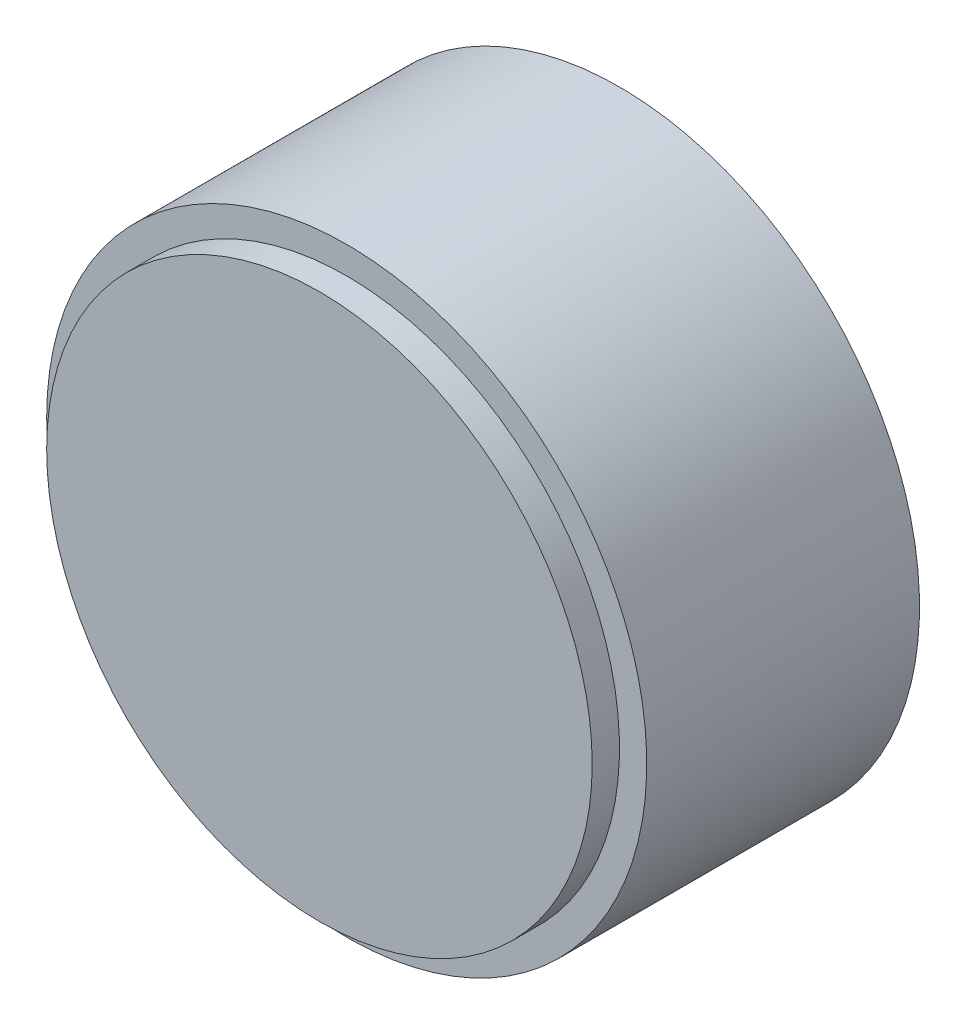
ISO-10303-21;
HEADER;
FILE_DESCRIPTION(('STEP AP214'),'2;1');
FILE_NAME('part.step','',(''),(''),'','','');
FILE_SCHEMA(('AUTOMOTIVE_DESIGN { 1 0 10303 214 1 1 1 1 }'));
ENDSEC;
DATA;
#1=APPLICATION_CONTEXT('core data for automotive mechanical design processes');
#2=APPLICATION_PROTOCOL_DEFINITION('international standard','automotive_design',2000,#1);
#3=PRODUCT_CONTEXT('',#1,'mechanical');
#4=PRODUCT('Part','Part','',(#3));
#5=PRODUCT_RELATED_PRODUCT_CATEGORY('part','',(#4));
#6=PRODUCT_DEFINITION_FORMATION('','',#4);
#7=PRODUCT_DEFINITION_CONTEXT('part definition',#1,'design');
#8=PRODUCT_DEFINITION('design','',#6,#7);
#9=PRODUCT_DEFINITION_SHAPE('','',#8);
#10=(LENGTH_UNIT() NAMED_UNIT(*) SI_UNIT(.MILLI.,.METRE.));
#11=(NAMED_UNIT(*) PLANE_ANGLE_UNIT() SI_UNIT($,.RADIAN.));
#12=(NAMED_UNIT(*) SI_UNIT($,.STERADIAN.) SOLID_ANGLE_UNIT());
#13=UNCERTAINTY_MEASURE_WITH_UNIT(LENGTH_MEASURE(1.E-05),#10,'distance_accuracy_value','');
#14=(GEOMETRIC_REPRESENTATION_CONTEXT(3) GLOBAL_UNCERTAINTY_ASSIGNED_CONTEXT((#13)) GLOBAL_UNIT_ASSIGNED_CONTEXT((#10,
#11,#12)) REPRESENTATION_CONTEXT('',''));
#15=CARTESIAN_POINT('',(0.,0.,0.));
#16=DIRECTION('',(0.,0.,1.));
#17=DIRECTION('',(1.,0.,0.));
#18=AXIS2_PLACEMENT_3D('',#15,#16,#17);
#19=CARTESIAN_POINT('',(0.,0.,35.));
#20=DIRECTION('',(0.,0.,-1.));
#21=DIRECTION('',(-1.,0.,0.));
#22=AXIS2_PLACEMENT_3D('',#19,#20,#21);
#23=CYLINDRICAL_SURFACE('',#22,30.);
#24=CARTESIAN_POINT('',(0.,0.,2.));
#25=DIRECTION('',(0.,0.,-1.));
#26=DIRECTION('',(-1.,0.,0.));
#27=AXIS2_PLACEMENT_3D('',#24,#25,#26);
#28=CIRCLE('',#27,30.);
#29=CARTESIAN_POINT('',(-30.,0.,2.));
#30=VERTEX_POINT('',#29);
#31=EDGE_CURVE('E101',#30,#30,#28,.T.);
#32=ORIENTED_EDGE('',*,*,#31,.T.);
#33=EDGE_LOOP('',(#32));
#34=FACE_BOUND('',#33,.T.);
#35=CARTESIAN_POINT('',(0.,0.,0.));
#36=DIRECTION('',(0.,0.,1.));
#37=DIRECTION('',(1.,0.,0.));
#38=AXIS2_PLACEMENT_3D('',#35,#36,#37);
#39=CIRCLE('',#38,30.);
#40=CARTESIAN_POINT('',(30.,0.,0.));
#41=VERTEX_POINT('',#40);
#42=EDGE_CURVE('E49',#41,#41,#39,.T.);
#43=ORIENTED_EDGE('',*,*,#42,.T.);
#44=EDGE_LOOP('',(#43));
#45=FACE_BOUND('',#44,.T.);
#46=ADVANCED_FACE('F37',(#34,#45),#23,.T.);
#47=CARTESIAN_POINT('',(0.,0.,0.));
#48=DIRECTION('',(0.,0.,1.));
#49=DIRECTION('',(1.,0.,0.));
#50=AXIS2_PLACEMENT_3D('',#47,#48,#49);
#51=PLANE('',#50);
#52=CARTESIAN_POINT('',(0.,8.,0.));
#53=DIRECTION('',(0.,0.,-1.));
#54=DIRECTION('',(-1.,0.,0.));
#55=AXIS2_PLACEMENT_3D('',#52,#53,#54);
#56=CIRCLE('',#55,2.);
#57=CARTESIAN_POINT('',(-2.,8.,0.));
#58=VERTEX_POINT('',#57);
#59=EDGE_CURVE('E74',#58,#58,#56,.T.);
#60=ORIENTED_EDGE('',*,*,#59,.F.);
#61=EDGE_LOOP('',(#60));
#62=FACE_BOUND('',#61,.T.);
#63=CARTESIAN_POINT('',(7.99999999999977,-2.27373675443232E-13,0.));
#64=DIRECTION('',(0.,0.,-1.));
#65=DIRECTION('',(-1.,0.,0.));
#66=AXIS2_PLACEMENT_3D('',#63,#64,#65);
#67=CIRCLE('',#66,2.00000000000036);
#68=CARTESIAN_POINT('',(5.99999999999941,-2.27373675443232E-13,0.));
#69=VERTEX_POINT('',#68);
#70=EDGE_CURVE('E75',#69,#69,#67,.T.);
#71=ORIENTED_EDGE('',*,*,#70,.F.);
#72=EDGE_LOOP('',(#71));
#73=FACE_BOUND('',#72,.T.);
#74=CARTESIAN_POINT('',(-4.52787916007828E-13,-8.,0.));
#75=DIRECTION('',(0.,0.,-1.));
#76=DIRECTION('',(-1.,0.,0.));
#77=AXIS2_PLACEMENT_3D('',#74,#75,#76);
#78=CIRCLE('',#77,2.00000000000049);
#79=CARTESIAN_POINT('',(-2.00000000000094,-8.,0.));
#80=VERTEX_POINT('',#79);
#81=EDGE_CURVE('E84',#80,#80,#78,.T.);
#82=ORIENTED_EDGE('',*,*,#81,.F.);
#83=EDGE_LOOP('',(#82));
#84=FACE_BOUND('',#83,.T.);
#85=CARTESIAN_POINT('',(-8.00000000000023,2.26393958003914E-13,0.));
#86=DIRECTION('',(0.,0.,-1.));
#87=DIRECTION('',(-1.,0.,0.));
#88=AXIS2_PLACEMENT_3D('',#85,#86,#87);
#89=CIRCLE('',#88,2.00000000000018);
#90=CARTESIAN_POINT('',(-10.0000000000004,2.26393958003914E-13,0.));
#91=VERTEX_POINT('',#90);
#92=EDGE_CURVE('E57',#91,#91,#89,.T.);
#93=ORIENTED_EDGE('',*,*,#92,.F.);
#94=EDGE_LOOP('',(#93));
#95=FACE_BOUND('',#94,.T.);
#96=CARTESIAN_POINT('',(0.,0.,0.));
#97=DIRECTION('',(0.,0.,-1.));
#98=DIRECTION('',(-1.,0.,0.));
#99=AXIS2_PLACEMENT_3D('',#96,#97,#98);
#100=CIRCLE('',#99,2.);
#101=CARTESIAN_POINT('',(-2.,0.,0.));
#102=VERTEX_POINT('',#101);
#103=EDGE_CURVE('E66',#102,#102,#100,.T.);
#104=ORIENTED_EDGE('',*,*,#103,.F.);
#105=EDGE_LOOP('',(#104));
#106=FACE_BOUND('',#105,.T.);
#107=ORIENTED_EDGE('',*,*,#42,.F.);
#108=EDGE_LOOP('',(#107));
#109=FACE_BOUND('',#108,.T.);
#110=ADVANCED_FACE('F133',(#62,#73,#84,#95,#106,#109),#51,.F.);
#111=CARTESIAN_POINT('',(0.,0.,10.));
#112=DIRECTION('',(0.,0.,-1.));
#113=DIRECTION('',(-1.,0.,0.));
#114=AXIS2_PLACEMENT_3D('',#111,#112,#113);
#115=CYLINDRICAL_SURFACE('',#114,2.);
#116=CARTESIAN_POINT('',(0.,0.,10.));
#117=DIRECTION('',(0.,0.,-1.));
#118=DIRECTION('',(-1.,0.,0.));
#119=AXIS2_PLACEMENT_3D('',#116,#117,#118);
#120=CIRCLE('',#119,2.);
#121=CARTESIAN_POINT('',(-2.,0.,10.));
#122=VERTEX_POINT('',#121);
#123=EDGE_CURVE('E70',#122,#122,#120,.T.);
#124=ORIENTED_EDGE('',*,*,#123,.F.);
#125=EDGE_LOOP('',(#124));
#126=FACE_BOUND('',#125,.T.);
#127=ORIENTED_EDGE('',*,*,#103,.T.);
#128=EDGE_LOOP('',(#127));
#129=FACE_BOUND('',#128,.T.);
#130=ADVANCED_FACE('F138',(#126,#129),#115,.F.);
#131=CARTESIAN_POINT('',(0.,0.,10.));
#132=DIRECTION('',(0.,0.,-1.));
#133=DIRECTION('',(-1.,0.,0.));
#134=AXIS2_PLACEMENT_3D('',#131,#132,#133);
#135=PLANE('',#134);
#136=ORIENTED_EDGE('',*,*,#123,.T.);
#137=EDGE_LOOP('',(#136));
#138=FACE_BOUND('',#137,.T.);
#139=ADVANCED_FACE('F154',(#138),#135,.T.);
#140=CARTESIAN_POINT('',(-8.00000000000023,2.26393958003914E-13,10.));
#141=DIRECTION('',(0.,0.,-1.));
#142=DIRECTION('',(-1.,0.,0.));
#143=AXIS2_PLACEMENT_3D('',#140,#141,#142);
#144=CYLINDRICAL_SURFACE('',#143,2.00000000000018);
#145=CARTESIAN_POINT('',(-8.00000000000023,2.26393958003914E-13,10.));
#146=DIRECTION('',(0.,0.,-1.));
#147=DIRECTION('',(-1.,0.,0.));
#148=AXIS2_PLACEMENT_3D('',#145,#146,#147);
#149=CIRCLE('',#148,2.00000000000018);
#150=CARTESIAN_POINT('',(-10.0000000000004,2.26393958003914E-13,10.));
#151=VERTEX_POINT('',#150);
#152=EDGE_CURVE('E61',#151,#151,#149,.T.);
#153=ORIENTED_EDGE('',*,*,#152,.F.);
#154=EDGE_LOOP('',(#153));
#155=FACE_BOUND('',#154,.T.);
#156=ORIENTED_EDGE('',*,*,#92,.T.);
#157=EDGE_LOOP('',(#156));
#158=FACE_BOUND('',#157,.T.);
#159=ADVANCED_FACE('F150',(#155,#158),#144,.F.);
#160=CARTESIAN_POINT('',(-8.00000000000023,2.26393958003914E-13,10.));
#161=DIRECTION('',(0.,0.,-1.));
#162=DIRECTION('',(-1.,0.,0.));
#163=AXIS2_PLACEMENT_3D('',#160,#161,#162);
#164=PLANE('',#163);
#165=ORIENTED_EDGE('',*,*,#152,.T.);
#166=EDGE_LOOP('',(#165));
#167=FACE_BOUND('',#166,.T.);
#168=ADVANCED_FACE('F153',(#167),#164,.T.);
#169=CARTESIAN_POINT('',(-4.52787916007828E-13,-8.,10.));
#170=DIRECTION('',(0.,0.,-1.));
#171=DIRECTION('',(-1.,0.,0.));
#172=AXIS2_PLACEMENT_3D('',#169,#170,#171);
#173=CYLINDRICAL_SURFACE('',#172,2.00000000000049);
#174=CARTESIAN_POINT('',(-4.52787916007828E-13,-8.,10.));
#175=DIRECTION('',(0.,0.,-1.));
#176=DIRECTION('',(-1.,0.,0.));
#177=AXIS2_PLACEMENT_3D('',#174,#175,#176);
#178=CIRCLE('',#177,2.00000000000049);
#179=CARTESIAN_POINT('',(-2.00000000000094,-8.,10.));
#180=VERTEX_POINT('',#179);
#181=EDGE_CURVE('E62',#180,#180,#178,.T.);
#182=ORIENTED_EDGE('',*,*,#181,.F.);
#183=EDGE_LOOP('',(#182));
#184=FACE_BOUND('',#183,.T.);
#185=ORIENTED_EDGE('',*,*,#81,.T.);
#186=EDGE_LOOP('',(#185));
#187=FACE_BOUND('',#186,.T.);
#188=ADVANCED_FACE('F158',(#184,#187),#173,.F.);
#189=CARTESIAN_POINT('',(-4.52787916007828E-13,-8.,10.));
#190=DIRECTION('',(0.,0.,-1.));
#191=DIRECTION('',(-1.,0.,0.));
#192=AXIS2_PLACEMENT_3D('',#189,#190,#191);
#193=PLANE('',#192);
#194=ORIENTED_EDGE('',*,*,#181,.T.);
#195=EDGE_LOOP('',(#194));
#196=FACE_BOUND('',#195,.T.);
#197=ADVANCED_FACE('F170',(#196),#193,.T.);
#198=CARTESIAN_POINT('',(7.99999999999977,-2.27373675443232E-13,10.));
#199=DIRECTION('',(0.,0.,-1.));
#200=DIRECTION('',(-1.,0.,0.));
#201=AXIS2_PLACEMENT_3D('',#198,#199,#200);
#202=CYLINDRICAL_SURFACE('',#201,2.00000000000036);
#203=CARTESIAN_POINT('',(7.99999999999977,-2.27373675443232E-13,10.));
#204=DIRECTION('',(0.,0.,-1.));
#205=DIRECTION('',(-1.,0.,0.));
#206=AXIS2_PLACEMENT_3D('',#203,#204,#205);
#207=CIRCLE('',#206,2.00000000000036);
#208=CARTESIAN_POINT('',(5.99999999999941,-2.27373675443232E-13,10.));
#209=VERTEX_POINT('',#208);
#210=EDGE_CURVE('E79',#209,#209,#207,.T.);
#211=ORIENTED_EDGE('',*,*,#210,.F.);
#212=EDGE_LOOP('',(#211));
#213=FACE_BOUND('',#212,.T.);
#214=ORIENTED_EDGE('',*,*,#70,.T.);
#215=EDGE_LOOP('',(#214));
#216=FACE_BOUND('',#215,.T.);
#217=ADVANCED_FACE('F166',(#213,#216),#202,.F.);
#218=CARTESIAN_POINT('',(7.99999999999977,-2.27373675443232E-13,10.));
#219=DIRECTION('',(0.,0.,-1.));
#220=DIRECTION('',(-1.,0.,0.));
#221=AXIS2_PLACEMENT_3D('',#218,#219,#220);
#222=PLANE('',#221);
#223=ORIENTED_EDGE('',*,*,#210,.T.);
#224=EDGE_LOOP('',(#223));
#225=FACE_BOUND('',#224,.T.);
#226=ADVANCED_FACE('F169',(#225),#222,.T.);
#227=CARTESIAN_POINT('',(0.,8.,10.));
#228=DIRECTION('',(0.,0.,-1.));
#229=DIRECTION('',(-1.,0.,0.));
#230=AXIS2_PLACEMENT_3D('',#227,#228,#229);
#231=CYLINDRICAL_SURFACE('',#230,2.);
#232=CARTESIAN_POINT('',(0.,8.,10.));
#233=DIRECTION('',(0.,0.,-1.));
#234=DIRECTION('',(-1.,0.,0.));
#235=AXIS2_PLACEMENT_3D('',#232,#233,#234);
#236=CIRCLE('',#235,2.);
#237=CARTESIAN_POINT('',(-2.,8.,10.));
#238=VERTEX_POINT('',#237);
#239=EDGE_CURVE('E55',#238,#238,#236,.T.);
#240=ORIENTED_EDGE('',*,*,#239,.F.);
#241=EDGE_LOOP('',(#240));
#242=FACE_BOUND('',#241,.T.);
#243=ORIENTED_EDGE('',*,*,#59,.T.);
#244=EDGE_LOOP('',(#243));
#245=FACE_BOUND('',#244,.T.);
#246=ADVANCED_FACE('F129',(#242,#245),#231,.F.);
#247=CARTESIAN_POINT('',(0.,8.,10.));
#248=DIRECTION('',(0.,0.,-1.));
#249=DIRECTION('',(-1.,0.,0.));
#250=AXIS2_PLACEMENT_3D('',#247,#248,#249);
#251=PLANE('',#250);
#252=ORIENTED_EDGE('',*,*,#239,.T.);
#253=EDGE_LOOP('',(#252));
#254=FACE_BOUND('',#253,.T.);
#255=ADVANCED_FACE('F121',(#254),#251,.T.);
#256=CARTESIAN_POINT('',(0.,0.,32.));
#257=DIRECTION('',(0.,0.,-1.));
#258=DIRECTION('',(-1.,0.,0.));
#259=AXIS2_PLACEMENT_3D('',#256,#257,#258);
#260=CYLINDRICAL_SURFACE('',#259,33.);
#261=CARTESIAN_POINT('',(0.,0.,32.));
#262=DIRECTION('',(0.,0.,-1.));
#263=DIRECTION('',(-1.,0.,0.));
#264=AXIS2_PLACEMENT_3D('',#261,#262,#263);
#265=CIRCLE('',#264,33.);
#266=CARTESIAN_POINT('',(-33.,0.,32.));
#267=VERTEX_POINT('',#266);
#268=EDGE_CURVE('E80',#267,#267,#265,.T.);
#269=ORIENTED_EDGE('',*,*,#268,.T.);
#270=EDGE_LOOP('',(#269));
#271=FACE_BOUND('',#270,.T.);
#272=CARTESIAN_POINT('',(0.,0.,2.));
#273=DIRECTION('',(0.,0.,-1.));
#274=DIRECTION('',(-1.,0.,0.));
#275=AXIS2_PLACEMENT_3D('',#272,#273,#274);
#276=CIRCLE('',#275,33.);
#277=CARTESIAN_POINT('',(-33.,0.,2.));
#278=VERTEX_POINT('',#277);
#279=EDGE_CURVE('E97',#278,#278,#276,.T.);
#280=ORIENTED_EDGE('',*,*,#279,.F.);
#281=EDGE_LOOP('',(#280));
#282=FACE_BOUND('',#281,.T.);
#283=ADVANCED_FACE('F119',(#271,#282),#260,.T.);
#284=CARTESIAN_POINT('',(0.,0.,32.));
#285=DIRECTION('',(0.,0.,-1.));
#286=DIRECTION('',(-1.,0.,0.));
#287=AXIS2_PLACEMENT_3D('',#284,#285,#286);
#288=PLANE('',#287);
#289=CARTESIAN_POINT('',(0.,0.,32.));
#290=DIRECTION('',(0.,0.,-1.));
#291=DIRECTION('',(-1.,0.,0.));
#292=AXIS2_PLACEMENT_3D('',#289,#290,#291);
#293=CIRCLE('',#292,30.);
#294=CARTESIAN_POINT('',(-30.,0.,32.));
#295=VERTEX_POINT('',#294);
#296=EDGE_CURVE('E10',#295,#295,#293,.T.);
#297=ORIENTED_EDGE('',*,*,#296,.T.);
#298=EDGE_LOOP('',(#297));
#299=FACE_BOUND('',#298,.T.);
#300=ORIENTED_EDGE('',*,*,#268,.F.);
#301=EDGE_LOOP('',(#300));
#302=FACE_BOUND('',#301,.T.);
#303=ADVANCED_FACE('F115',(#299,#302),#288,.F.);
#304=CARTESIAN_POINT('',(0.,0.,2.));
#305=DIRECTION('',(0.,0.,-1.));
#306=DIRECTION('',(-1.,0.,0.));
#307=AXIS2_PLACEMENT_3D('',#304,#305,#306);
#308=PLANE('',#307);
#309=ORIENTED_EDGE('',*,*,#31,.F.);
#310=EDGE_LOOP('',(#309));
#311=FACE_BOUND('',#310,.T.);
#312=ORIENTED_EDGE('',*,*,#279,.T.);
#313=EDGE_LOOP('',(#312));
#314=FACE_BOUND('',#313,.T.);
#315=ADVANCED_FACE('F111',(#311,#314),#308,.T.);
#316=CARTESIAN_POINT('',(0.,0.,35.));
#317=DIRECTION('',(0.,0.,1.));
#318=DIRECTION('',(1.,0.,0.));
#319=AXIS2_PLACEMENT_3D('',#316,#317,#318);
#320=PLANE('',#319);
#321=CARTESIAN_POINT('',(0.,0.,35.));
#322=DIRECTION('',(0.,0.,1.));
#323=DIRECTION('',(1.,0.,0.));
#324=AXIS2_PLACEMENT_3D('',#321,#322,#323);
#325=CIRCLE('',#324,30.);
#326=CARTESIAN_POINT('',(30.,0.,35.));
#327=VERTEX_POINT('',#326);
#328=EDGE_CURVE('E44',#327,#327,#325,.T.);
#329=ORIENTED_EDGE('',*,*,#328,.T.);
#330=EDGE_LOOP('',(#329));
#331=FACE_BOUND('',#330,.T.);
#332=ADVANCED_FACE('F114',(#331),#320,.T.);
#333=ORIENTED_EDGE('',*,*,#328,.F.);
#334=EDGE_LOOP('',(#333));
#335=FACE_BOUND('',#334,.T.);
#336=ORIENTED_EDGE('',*,*,#296,.F.);
#337=EDGE_LOOP('',(#336));
#338=FACE_BOUND('',#337,.T.);
#339=ADVANCED_FACE('F134',(#335,#338),#23,.T.);
#340=CLOSED_SHELL('',(#46,#110,#130,#139,#159,#168,#188,#197,#217,#226,#246,#255,#283,#303,#315,
#332,#339));
#341=MANIFOLD_SOLID_BREP('B2',#340);
#342=ADVANCED_BREP_SHAPE_REPRESENTATION('',(#18,#341),#14);
#343=SHAPE_DEFINITION_REPRESENTATION(#9,#342);
ENDSEC;
END-ISO-10303-21;
